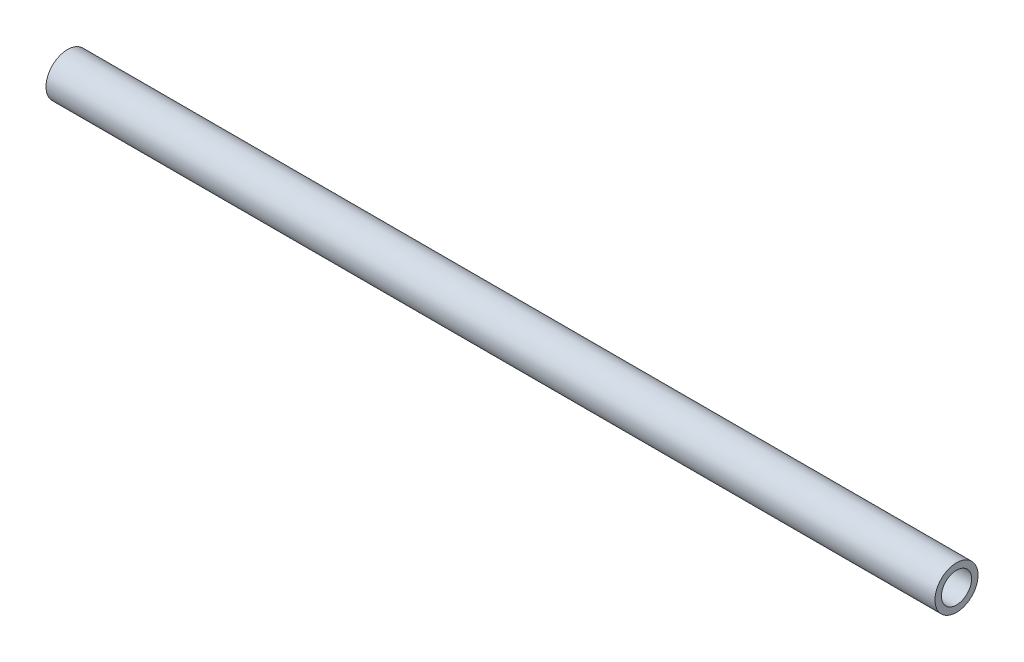
ISO-10303-21;
HEADER;
FILE_DESCRIPTION(('STEP AP214'),'2;1');
FILE_NAME('part.step','',(''),(''),'','','');
FILE_SCHEMA(('AUTOMOTIVE_DESIGN { 1 0 10303 214 1 1 1 1 }'));
ENDSEC;
DATA;
#1=APPLICATION_CONTEXT('core data for automotive mechanical design processes');
#2=APPLICATION_PROTOCOL_DEFINITION('international standard','automotive_design',2000,#1);
#3=PRODUCT_CONTEXT('',#1,'mechanical');
#4=PRODUCT('Part','Part','',(#3));
#5=PRODUCT_RELATED_PRODUCT_CATEGORY('part','',(#4));
#6=PRODUCT_DEFINITION_FORMATION('','',#4);
#7=PRODUCT_DEFINITION_CONTEXT('part definition',#1,'design');
#8=PRODUCT_DEFINITION('design','',#6,#7);
#9=PRODUCT_DEFINITION_SHAPE('','',#8);
#10=(LENGTH_UNIT() NAMED_UNIT(*) SI_UNIT(.MILLI.,.METRE.));
#11=(NAMED_UNIT(*) PLANE_ANGLE_UNIT() SI_UNIT($,.RADIAN.));
#12=(NAMED_UNIT(*) SI_UNIT($,.STERADIAN.) SOLID_ANGLE_UNIT());
#13=UNCERTAINTY_MEASURE_WITH_UNIT(LENGTH_MEASURE(1.E-05),#10,'distance_accuracy_value','');
#14=(GEOMETRIC_REPRESENTATION_CONTEXT(3) GLOBAL_UNCERTAINTY_ASSIGNED_CONTEXT((#13)) GLOBAL_UNIT_ASSIGNED_CONTEXT((#10,
#11,#12)) REPRESENTATION_CONTEXT('',''));
#15=CARTESIAN_POINT('',(0.,0.,0.));
#16=DIRECTION('',(0.,0.,1.));
#17=DIRECTION('',(1.,0.,0.));
#18=AXIS2_PLACEMENT_3D('',#15,#16,#17);
#19=CARTESIAN_POINT('',(0.,2.2,0.));
#20=DIRECTION('',(1.,0.,0.));
#21=DIRECTION('',(0.,0.,-1.));
#22=AXIS2_PLACEMENT_3D('',#19,#20,#21);
#23=PLANE('',#22);
#24=CARTESIAN_POINT('',(0.,0.,0.));
#25=DIRECTION('',(-1.,0.,0.));
#26=DIRECTION('',(0.,0.,1.));
#27=AXIS2_PLACEMENT_3D('',#24,#25,#26);
#28=CIRCLE('',#27,1.54);
#29=CARTESIAN_POINT('',(0.,0.,1.54));
#30=VERTEX_POINT('',#29);
#31=EDGE_CURVE('E10',#30,#30,#28,.T.);
#32=ORIENTED_EDGE('',*,*,#31,.F.);
#33=EDGE_LOOP('',(#32));
#34=FACE_BOUND('',#33,.T.);
#35=CARTESIAN_POINT('',(0.,0.,0.));
#36=DIRECTION('',(-1.,0.,0.));
#37=DIRECTION('',(0.,0.,1.));
#38=AXIS2_PLACEMENT_3D('',#35,#36,#37);
#39=CIRCLE('',#38,2.2);
#40=CARTESIAN_POINT('',(0.,0.,2.2));
#41=VERTEX_POINT('',#40);
#42=EDGE_CURVE('E50',#41,#41,#39,.T.);
#43=ORIENTED_EDGE('',*,*,#42,.T.);
#44=EDGE_LOOP('',(#43));
#45=FACE_BOUND('',#44,.T.);
#46=ADVANCED_FACE('F32',(#34,#45),#23,.F.);
#47=CARTESIAN_POINT('',(0.,0.,0.));
#48=DIRECTION('',(-1.,0.,0.));
#49=DIRECTION('',(0.,0.,1.));
#50=AXIS2_PLACEMENT_3D('',#47,#48,#49);
#51=CYLINDRICAL_SURFACE('',#50,1.54);
#52=CARTESIAN_POINT('',(90.8,0.,0.));
#53=DIRECTION('',(-1.,0.,0.));
#54=DIRECTION('',(0.,0.,1.));
#55=AXIS2_PLACEMENT_3D('',#52,#53,#54);
#56=CIRCLE('',#55,1.54);
#57=CARTESIAN_POINT('',(90.8,0.,1.54));
#58=VERTEX_POINT('',#57);
#59=EDGE_CURVE('E39',#58,#58,#56,.T.);
#60=ORIENTED_EDGE('',*,*,#59,.F.);
#61=EDGE_LOOP('',(#60));
#62=FACE_BOUND('',#61,.T.);
#63=ORIENTED_EDGE('',*,*,#31,.T.);
#64=EDGE_LOOP('',(#63));
#65=FACE_BOUND('',#64,.T.);
#66=ADVANCED_FACE('F67',(#62,#65),#51,.F.);
#67=CARTESIAN_POINT('',(90.8,2.2,0.));
#68=DIRECTION('',(-1.,0.,0.));
#69=DIRECTION('',(0.,0.,1.));
#70=AXIS2_PLACEMENT_3D('',#67,#68,#69);
#71=PLANE('',#70);
#72=CARTESIAN_POINT('',(90.8,0.,0.));
#73=DIRECTION('',(-1.,0.,0.));
#74=DIRECTION('',(0.,0.,1.));
#75=AXIS2_PLACEMENT_3D('',#72,#73,#74);
#76=CIRCLE('',#75,2.2);
#77=CARTESIAN_POINT('',(90.8,0.,2.2));
#78=VERTEX_POINT('',#77);
#79=EDGE_CURVE('E46',#78,#78,#76,.T.);
#80=ORIENTED_EDGE('',*,*,#79,.F.);
#81=EDGE_LOOP('',(#80));
#82=FACE_BOUND('',#81,.T.);
#83=ORIENTED_EDGE('',*,*,#59,.T.);
#84=EDGE_LOOP('',(#83));
#85=FACE_BOUND('',#84,.T.);
#86=ADVANCED_FACE('F62',(#82,#85),#71,.F.);
#87=CARTESIAN_POINT('',(0.,0.,0.));
#88=DIRECTION('',(-1.,0.,0.));
#89=DIRECTION('',(0.,0.,1.));
#90=AXIS2_PLACEMENT_3D('',#87,#88,#89);
#91=CYLINDRICAL_SURFACE('',#90,2.2);
#92=ORIENTED_EDGE('',*,*,#42,.F.);
#93=EDGE_LOOP('',(#92));
#94=FACE_BOUND('',#93,.T.);
#95=ORIENTED_EDGE('',*,*,#79,.T.);
#96=EDGE_LOOP('',(#95));
#97=FACE_BOUND('',#96,.T.);
#98=ADVANCED_FACE('F59',(#94,#97),#91,.T.);
#99=CLOSED_SHELL('',(#46,#66,#86,#98));
#100=MANIFOLD_SOLID_BREP('B2',#99);
#101=ADVANCED_BREP_SHAPE_REPRESENTATION('',(#18,#100),#14);
#102=SHAPE_DEFINITION_REPRESENTATION(#9,#101);
ENDSEC;
END-ISO-10303-21;
